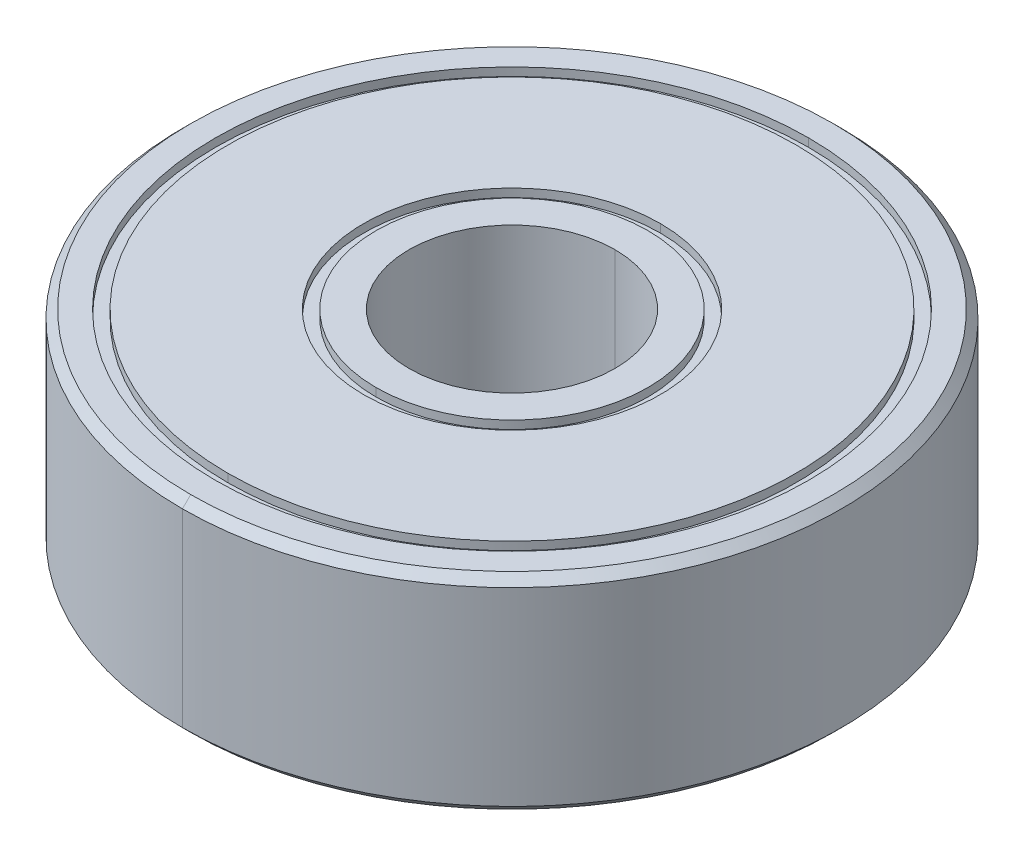
ISO-10303-21;
HEADER;
FILE_DESCRIPTION(('STEP AP214'),'2;1');
FILE_NAME('part.step','',(''),(''),'','','');
FILE_SCHEMA(('AUTOMOTIVE_DESIGN { 1 0 10303 214 1 1 1 1 }'));
ENDSEC;
DATA;
#1=APPLICATION_CONTEXT('core data for automotive mechanical design processes');
#2=APPLICATION_PROTOCOL_DEFINITION('international standard','automotive_design',2000,#1);
#3=PRODUCT_CONTEXT('',#1,'mechanical');
#4=PRODUCT('Part','Part','',(#3));
#5=PRODUCT_RELATED_PRODUCT_CATEGORY('part','',(#4));
#6=PRODUCT_DEFINITION_FORMATION('','',#4);
#7=PRODUCT_DEFINITION_CONTEXT('part definition',#1,'design');
#8=PRODUCT_DEFINITION('design','',#6,#7);
#9=PRODUCT_DEFINITION_SHAPE('','',#8);
#10=(LENGTH_UNIT() NAMED_UNIT(*) SI_UNIT(.MILLI.,.METRE.));
#11=(NAMED_UNIT(*) PLANE_ANGLE_UNIT() SI_UNIT($,.RADIAN.));
#12=(NAMED_UNIT(*) SI_UNIT($,.STERADIAN.) SOLID_ANGLE_UNIT());
#13=UNCERTAINTY_MEASURE_WITH_UNIT(LENGTH_MEASURE(1.E-05),#10,'distance_accuracy_value','');
#14=(GEOMETRIC_REPRESENTATION_CONTEXT(3) GLOBAL_UNCERTAINTY_ASSIGNED_CONTEXT((#13)) GLOBAL_UNIT_ASSIGNED_CONTEXT((#10,
#11,#12)) REPRESENTATION_CONTEXT('',''));
#15=CARTESIAN_POINT('',(0.,0.,0.));
#16=DIRECTION('',(0.,0.,1.));
#17=DIRECTION('',(1.,0.,0.));
#18=AXIS2_PLACEMENT_3D('',#15,#16,#17);
#19=CARTESIAN_POINT('',(0.,5.,0.));
#20=DIRECTION('',(0.,-1.,0.));
#21=DIRECTION('',(0.,0.,-1.));
#22=AXIS2_PLACEMENT_3D('',#19,#20,#21);
#23=CYLINDRICAL_SURFACE('',#22,2.5);
#24=DIRECTION('',(0.,-1.,0.));
#25=VECTOR('',#24,1.);
#26=CARTESIAN_POINT('',(0.,5.,2.5));
#27=LINE('',#26,#25);
#28=CARTESIAN_POINT('',(0.,5.,2.5));
#29=VERTEX_POINT('',#28);
#30=CARTESIAN_POINT('',(0.,0.,2.5));
#31=VERTEX_POINT('',#30);
#32=EDGE_CURVE('E168',#29,#31,#27,.T.);
#33=ORIENTED_EDGE('',*,*,#32,.T.);
#34=CARTESIAN_POINT('',(0.,0.,0.));
#35=DIRECTION('',(0.,-1.,0.));
#36=DIRECTION('',(0.,0.,-1.));
#37=AXIS2_PLACEMENT_3D('',#34,#35,#36);
#38=CIRCLE('',#37,2.5);
#39=CARTESIAN_POINT('',(0.,0.,-2.5));
#40=VERTEX_POINT('',#39);
#41=EDGE_CURVE('E178',#31,#40,#38,.T.);
#42=ORIENTED_EDGE('',*,*,#41,.T.);
#43=DIRECTION('',(0.,-1.,0.));
#44=VECTOR('',#43,1.);
#45=CARTESIAN_POINT('',(0.,5.,-2.5));
#46=LINE('',#45,#44);
#47=CARTESIAN_POINT('',(0.,5.,-2.5));
#48=VERTEX_POINT('',#47);
#49=EDGE_CURVE('E163',#40,#48,#46,.F.);
#50=ORIENTED_EDGE('',*,*,#49,.T.);
#51=CARTESIAN_POINT('',(0.,5.,0.));
#52=DIRECTION('',(0.,-1.,0.));
#53=DIRECTION('',(0.,0.,-1.));
#54=AXIS2_PLACEMENT_3D('',#51,#52,#53);
#55=CIRCLE('',#54,2.5);
#56=EDGE_CURVE('E176',#29,#48,#55,.T.);
#57=ORIENTED_EDGE('',*,*,#56,.F.);
#58=EDGE_LOOP('',(#33,#42,#50,#57));
#59=FACE_BOUND('',#58,.T.);
#60=ADVANCED_FACE('F17',(#59),#23,.F.);
#61=CARTESIAN_POINT('',(0.,5.,0.));
#62=DIRECTION('',(0.,-1.,0.));
#63=DIRECTION('',(0.,0.,-1.));
#64=AXIS2_PLACEMENT_3D('',#61,#62,#63);
#65=CYLINDRICAL_SURFACE('',#64,2.5);
#66=CARTESIAN_POINT('',(0.,5.,0.));
#67=DIRECTION('',(0.,-1.,0.));
#68=DIRECTION('',(0.,0.,-1.));
#69=AXIS2_PLACEMENT_3D('',#66,#67,#68);
#70=CIRCLE('',#69,2.5);
#71=EDGE_CURVE('E20',#48,#29,#70,.T.);
#72=ORIENTED_EDGE('',*,*,#71,.F.);
#73=ORIENTED_EDGE('',*,*,#49,.F.);
#74=CARTESIAN_POINT('',(0.,0.,0.));
#75=DIRECTION('',(0.,-1.,0.));
#76=DIRECTION('',(0.,0.,-1.));
#77=AXIS2_PLACEMENT_3D('',#74,#75,#76);
#78=CIRCLE('',#77,2.5);
#79=EDGE_CURVE('E173',#40,#31,#78,.T.);
#80=ORIENTED_EDGE('',*,*,#79,.T.);
#81=ORIENTED_EDGE('',*,*,#32,.F.);
#82=EDGE_LOOP('',(#72,#73,#80,#81));
#83=FACE_BOUND('',#82,.T.);
#84=ADVANCED_FACE('F169',(#83),#65,.F.);
#85=CARTESIAN_POINT('',(0.,5.,0.));
#86=DIRECTION('',(0.,1.,0.));
#87=DIRECTION('',(0.,0.,1.));
#88=AXIS2_PLACEMENT_3D('',#85,#86,#87);
#89=PLANE('',#88);
#90=ORIENTED_EDGE('',*,*,#71,.T.);
#91=ORIENTED_EDGE('',*,*,#56,.T.);
#92=EDGE_LOOP('',(#90,#91));
#93=FACE_BOUND('',#92,.T.);
#94=CARTESIAN_POINT('',(0.,5.,0.));
#95=DIRECTION('',(0.,1.,0.));
#96=DIRECTION('',(0.,0.,1.));
#97=AXIS2_PLACEMENT_3D('',#94,#95,#96);
#98=CIRCLE('',#97,3.3);
#99=CARTESIAN_POINT('',(0.,5.,3.3));
#100=VERTEX_POINT('',#99);
#101=CARTESIAN_POINT('',(0.,5.,-3.3));
#102=VERTEX_POINT('',#101);
#103=EDGE_CURVE('E185',#100,#102,#98,.F.);
#104=ORIENTED_EDGE('',*,*,#103,.F.);
#105=CARTESIAN_POINT('',(0.,5.,0.));
#106=DIRECTION('',(0.,1.,0.));
#107=DIRECTION('',(0.,0.,1.));
#108=AXIS2_PLACEMENT_3D('',#105,#106,#107);
#109=CIRCLE('',#108,3.3);
#110=EDGE_CURVE('E188',#102,#100,#109,.F.);
#111=ORIENTED_EDGE('',*,*,#110,.F.);
#112=EDGE_LOOP('',(#104,#111));
#113=FACE_BOUND('',#112,.T.);
#114=ADVANCED_FACE('F179',(#93,#113),#89,.T.);
#115=CARTESIAN_POINT('',(0.,0.,0.));
#116=DIRECTION('',(0.,1.,0.));
#117=DIRECTION('',(0.,0.,1.));
#118=AXIS2_PLACEMENT_3D('',#115,#116,#117);
#119=PLANE('',#118);
#120=ORIENTED_EDGE('',*,*,#41,.F.);
#121=ORIENTED_EDGE('',*,*,#79,.F.);
#122=EDGE_LOOP('',(#120,#121));
#123=FACE_BOUND('',#122,.T.);
#124=CARTESIAN_POINT('',(0.,0.,0.));
#125=DIRECTION('',(0.,1.,0.));
#126=DIRECTION('',(0.,0.,1.));
#127=AXIS2_PLACEMENT_3D('',#124,#125,#126);
#128=CIRCLE('',#127,3.3);
#129=CARTESIAN_POINT('',(0.,0.,-3.3));
#130=VERTEX_POINT('',#129);
#131=CARTESIAN_POINT('',(0.,0.,3.3));
#132=VERTEX_POINT('',#131);
#133=EDGE_CURVE('E217',#130,#132,#128,.T.);
#134=ORIENTED_EDGE('',*,*,#133,.F.);
#135=CARTESIAN_POINT('',(0.,0.,0.));
#136=DIRECTION('',(0.,1.,0.));
#137=DIRECTION('',(0.,0.,1.));
#138=AXIS2_PLACEMENT_3D('',#135,#136,#137);
#139=CIRCLE('',#138,3.3);
#140=EDGE_CURVE('E201',#132,#130,#139,.T.);
#141=ORIENTED_EDGE('',*,*,#140,.F.);
#142=EDGE_LOOP('',(#134,#141));
#143=FACE_BOUND('',#142,.T.);
#144=ADVANCED_FACE('F182',(#123,#143),#119,.F.);
#145=CARTESIAN_POINT('',(0.,5.,0.));
#146=DIRECTION('',(0.,1.,0.));
#147=DIRECTION('',(0.,0.,1.));
#148=AXIS2_PLACEMENT_3D('',#145,#146,#147);
#149=CYLINDRICAL_SURFACE('',#148,3.3);
#150=DIRECTION('',(0.,1.,0.));
#151=VECTOR('',#150,1.);
#152=CARTESIAN_POINT('',(0.,5.,3.3));
#153=LINE('',#152,#151);
#154=CARTESIAN_POINT('',(0.,4.8,3.3));
#155=VERTEX_POINT('',#154);
#156=EDGE_CURVE('E194',#100,#155,#153,.F.);
#157=ORIENTED_EDGE('',*,*,#156,.F.);
#158=ORIENTED_EDGE('',*,*,#103,.T.);
#159=DIRECTION('',(0.,1.,0.));
#160=VECTOR('',#159,1.);
#161=CARTESIAN_POINT('',(0.,5.,-3.3));
#162=LINE('',#161,#160);
#163=CARTESIAN_POINT('',(0.,4.8,-3.3));
#164=VERTEX_POINT('',#163);
#165=EDGE_CURVE('E191',#164,#102,#162,.T.);
#166=ORIENTED_EDGE('',*,*,#165,.F.);
#167=CARTESIAN_POINT('',(0.,4.8,0.));
#168=DIRECTION('',(0.,1.,0.));
#169=DIRECTION('',(0.,0.,1.));
#170=AXIS2_PLACEMENT_3D('',#167,#168,#169);
#171=CIRCLE('',#170,3.3);
#172=EDGE_CURVE('E197',#155,#164,#171,.F.);
#173=ORIENTED_EDGE('',*,*,#172,.F.);
#174=EDGE_LOOP('',(#157,#158,#166,#173));
#175=FACE_BOUND('',#174,.T.);
#176=ADVANCED_FACE('F195',(#175),#149,.T.);
#177=CARTESIAN_POINT('',(0.,5.,0.));
#178=DIRECTION('',(0.,1.,0.));
#179=DIRECTION('',(0.,0.,1.));
#180=AXIS2_PLACEMENT_3D('',#177,#178,#179);
#181=CYLINDRICAL_SURFACE('',#180,3.3);
#182=ORIENTED_EDGE('',*,*,#110,.T.);
#183=ORIENTED_EDGE('',*,*,#156,.T.);
#184=CARTESIAN_POINT('',(0.,4.8,0.));
#185=DIRECTION('',(0.,1.,0.));
#186=DIRECTION('',(0.,0.,1.));
#187=AXIS2_PLACEMENT_3D('',#184,#185,#186);
#188=CIRCLE('',#187,3.3);
#189=EDGE_CURVE('E324',#164,#155,#188,.F.);
#190=ORIENTED_EDGE('',*,*,#189,.F.);
#191=ORIENTED_EDGE('',*,*,#165,.T.);
#192=EDGE_LOOP('',(#182,#183,#190,#191));
#193=FACE_BOUND('',#192,.T.);
#194=ADVANCED_FACE('F203',(#193),#181,.T.);
#195=CARTESIAN_POINT('',(0.,5.,0.));
#196=DIRECTION('',(0.,1.,0.));
#197=DIRECTION('',(0.,0.,1.));
#198=AXIS2_PLACEMENT_3D('',#195,#196,#197);
#199=CYLINDRICAL_SURFACE('',#198,3.3);
#200=CARTESIAN_POINT('',(0.,0.2,0.));
#201=DIRECTION('',(0.,1.,0.));
#202=DIRECTION('',(0.,0.,1.));
#203=AXIS2_PLACEMENT_3D('',#200,#201,#202);
#204=CIRCLE('',#203,3.3);
#205=CARTESIAN_POINT('',(0.,0.2,3.3));
#206=VERTEX_POINT('',#205);
#207=CARTESIAN_POINT('',(0.,0.2,-3.3));
#208=VERTEX_POINT('',#207);
#209=EDGE_CURVE('E322',#206,#208,#204,.T.);
#210=ORIENTED_EDGE('',*,*,#209,.F.);
#211=DIRECTION('',(0.,1.,0.));
#212=VECTOR('',#211,1.);
#213=CARTESIAN_POINT('',(0.,5.,3.3));
#214=LINE('',#213,#212);
#215=EDGE_CURVE('E222',#132,#206,#214,.T.);
#216=ORIENTED_EDGE('',*,*,#215,.F.);
#217=ORIENTED_EDGE('',*,*,#140,.T.);
#218=DIRECTION('',(0.,1.,0.));
#219=VECTOR('',#218,1.);
#220=CARTESIAN_POINT('',(0.,5.,-3.3));
#221=LINE('',#220,#219);
#222=EDGE_CURVE('E223',#208,#130,#221,.F.);
#223=ORIENTED_EDGE('',*,*,#222,.F.);
#224=EDGE_LOOP('',(#210,#216,#217,#223));
#225=FACE_BOUND('',#224,.T.);
#226=ADVANCED_FACE('F330',(#225),#199,.T.);
#227=CARTESIAN_POINT('',(0.,5.,0.));
#228=DIRECTION('',(0.,1.,0.));
#229=DIRECTION('',(0.,0.,1.));
#230=AXIS2_PLACEMENT_3D('',#227,#228,#229);
#231=CYLINDRICAL_SURFACE('',#230,3.3);
#232=ORIENTED_EDGE('',*,*,#215,.T.);
#233=CARTESIAN_POINT('',(0.,0.2,0.));
#234=DIRECTION('',(0.,1.,0.));
#235=DIRECTION('',(0.,0.,1.));
#236=AXIS2_PLACEMENT_3D('',#233,#234,#235);
#237=CIRCLE('',#236,3.3);
#238=EDGE_CURVE('E227',#208,#206,#237,.T.);
#239=ORIENTED_EDGE('',*,*,#238,.F.);
#240=ORIENTED_EDGE('',*,*,#222,.T.);
#241=ORIENTED_EDGE('',*,*,#133,.T.);
#242=EDGE_LOOP('',(#232,#239,#240,#241));
#243=FACE_BOUND('',#242,.T.);
#244=ADVANCED_FACE('F225',(#243),#231,.T.);
#245=CARTESIAN_POINT('',(0.,4.8,-3.3));
#246=DIRECTION('',(0.,1.,0.));
#247=DIRECTION('',(0.,0.,1.));
#248=AXIS2_PLACEMENT_3D('',#245,#246,#247);
#249=PLANE('',#248);
#250=CARTESIAN_POINT('',(0.,4.8,0.));
#251=DIRECTION('',(0.,1.,0.));
#252=DIRECTION('',(0.,0.,1.));
#253=AXIS2_PLACEMENT_3D('',#250,#251,#252);
#254=CIRCLE('',#253,3.6);
#255=CARTESIAN_POINT('',(0.,4.8,3.6));
#256=VERTEX_POINT('',#255);
#257=CARTESIAN_POINT('',(0.,4.8,-3.6));
#258=VERTEX_POINT('',#257);
#259=EDGE_CURVE('E316',#256,#258,#254,.T.);
#260=ORIENTED_EDGE('',*,*,#259,.T.);
#261=CARTESIAN_POINT('',(0.,4.8,0.));
#262=DIRECTION('',(0.,1.,0.));
#263=DIRECTION('',(0.,0.,1.));
#264=AXIS2_PLACEMENT_3D('',#261,#262,#263);
#265=CIRCLE('',#264,3.6);
#266=EDGE_CURVE('E319',#258,#256,#265,.T.);
#267=ORIENTED_EDGE('',*,*,#266,.T.);
#268=EDGE_LOOP('',(#260,#267));
#269=FACE_BOUND('',#268,.T.);
#270=ORIENTED_EDGE('',*,*,#172,.T.);
#271=ORIENTED_EDGE('',*,*,#189,.T.);
#272=EDGE_LOOP('',(#270,#271));
#273=FACE_BOUND('',#272,.T.);
#274=ADVANCED_FACE('F338',(#269,#273),#249,.T.);
#275=CARTESIAN_POINT('',(0.,0.2,-3.3));
#276=DIRECTION('',(0.,-1.,0.));
#277=DIRECTION('',(0.,0.,-1.));
#278=AXIS2_PLACEMENT_3D('',#275,#276,#277);
#279=PLANE('',#278);
#280=ORIENTED_EDGE('',*,*,#209,.T.);
#281=ORIENTED_EDGE('',*,*,#238,.T.);
#282=EDGE_LOOP('',(#280,#281));
#283=FACE_BOUND('',#282,.T.);
#284=CARTESIAN_POINT('',(0.,0.2,0.));
#285=DIRECTION('',(0.,1.,0.));
#286=DIRECTION('',(0.,0.,1.));
#287=AXIS2_PLACEMENT_3D('',#284,#285,#286);
#288=CIRCLE('',#287,3.6);
#289=CARTESIAN_POINT('',(0.,0.2,3.6));
#290=VERTEX_POINT('',#289);
#291=CARTESIAN_POINT('',(0.,0.2,-3.6));
#292=VERTEX_POINT('',#291);
#293=EDGE_CURVE('E310',#290,#292,#288,.F.);
#294=ORIENTED_EDGE('',*,*,#293,.T.);
#295=CARTESIAN_POINT('',(0.,0.2,0.));
#296=DIRECTION('',(0.,1.,0.));
#297=DIRECTION('',(0.,0.,1.));
#298=AXIS2_PLACEMENT_3D('',#295,#296,#297);
#299=CIRCLE('',#298,3.6);
#300=EDGE_CURVE('E313',#292,#290,#299,.F.);
#301=ORIENTED_EDGE('',*,*,#300,.T.);
#302=EDGE_LOOP('',(#294,#301));
#303=FACE_BOUND('',#302,.T.);
#304=ADVANCED_FACE('F328',(#283,#303),#279,.T.);
#305=CARTESIAN_POINT('',(0.,5.,0.));
#306=DIRECTION('',(0.,1.,0.));
#307=DIRECTION('',(0.,0.,1.));
#308=AXIS2_PLACEMENT_3D('',#305,#306,#307);
#309=CYLINDRICAL_SURFACE('',#308,3.6);
#310=DIRECTION('',(0.,1.,0.));
#311=VECTOR('',#310,1.);
#312=CARTESIAN_POINT('',(0.,5.,-3.6));
#313=LINE('',#312,#311);
#314=CARTESIAN_POINT('',(0.,5.,-3.6));
#315=VERTEX_POINT('',#314);
#316=EDGE_CURVE('E315',#258,#315,#313,.T.);
#317=ORIENTED_EDGE('',*,*,#316,.T.);
#318=CARTESIAN_POINT('',(0.,5.,0.));
#319=DIRECTION('',(0.,1.,0.));
#320=DIRECTION('',(0.,0.,1.));
#321=AXIS2_PLACEMENT_3D('',#318,#319,#320);
#322=CIRCLE('',#321,3.6);
#323=CARTESIAN_POINT('',(0.,5.,3.6));
#324=VERTEX_POINT('',#323);
#325=EDGE_CURVE('E306',#324,#315,#322,.F.);
#326=ORIENTED_EDGE('',*,*,#325,.F.);
#327=DIRECTION('',(0.,1.,0.));
#328=VECTOR('',#327,1.);
#329=CARTESIAN_POINT('',(0.,5.,3.6));
#330=LINE('',#329,#328);
#331=EDGE_CURVE('E318',#324,#256,#330,.F.);
#332=ORIENTED_EDGE('',*,*,#331,.T.);
#333=ORIENTED_EDGE('',*,*,#266,.F.);
#334=EDGE_LOOP('',(#317,#326,#332,#333));
#335=FACE_BOUND('',#334,.T.);
#336=ADVANCED_FACE('F435',(#335),#309,.F.);
#337=CARTESIAN_POINT('',(0.,5.,0.));
#338=DIRECTION('',(0.,1.,0.));
#339=DIRECTION('',(0.,0.,1.));
#340=AXIS2_PLACEMENT_3D('',#337,#338,#339);
#341=CYLINDRICAL_SURFACE('',#340,3.6);
#342=ORIENTED_EDGE('',*,*,#259,.F.);
#343=ORIENTED_EDGE('',*,*,#331,.F.);
#344=CARTESIAN_POINT('',(0.,5.,0.));
#345=DIRECTION('',(0.,1.,0.));
#346=DIRECTION('',(0.,0.,1.));
#347=AXIS2_PLACEMENT_3D('',#344,#345,#346);
#348=CIRCLE('',#347,3.6);
#349=EDGE_CURVE('E303',#315,#324,#348,.F.);
#350=ORIENTED_EDGE('',*,*,#349,.F.);
#351=ORIENTED_EDGE('',*,*,#316,.F.);
#352=EDGE_LOOP('',(#342,#343,#350,#351));
#353=FACE_BOUND('',#352,.T.);
#354=ADVANCED_FACE('F431',(#353),#341,.F.);
#355=CARTESIAN_POINT('',(0.,5.,0.));
#356=DIRECTION('',(0.,1.,0.));
#357=DIRECTION('',(0.,0.,1.));
#358=AXIS2_PLACEMENT_3D('',#355,#356,#357);
#359=CYLINDRICAL_SURFACE('',#358,3.6);
#360=CARTESIAN_POINT('',(0.,0.,0.));
#361=DIRECTION('',(0.,1.,0.));
#362=DIRECTION('',(0.,0.,1.));
#363=AXIS2_PLACEMENT_3D('',#360,#361,#362);
#364=CIRCLE('',#363,3.6);
#365=CARTESIAN_POINT('',(0.,0.,-3.6));
#366=VERTEX_POINT('',#365);
#367=CARTESIAN_POINT('',(0.,0.,3.6));
#368=VERTEX_POINT('',#367);
#369=EDGE_CURVE('E301',#366,#368,#364,.F.);
#370=ORIENTED_EDGE('',*,*,#369,.T.);
#371=DIRECTION('',(0.,1.,0.));
#372=VECTOR('',#371,1.);
#373=CARTESIAN_POINT('',(0.,5.,3.6));
#374=LINE('',#373,#372);
#375=EDGE_CURVE('E312',#368,#290,#374,.T.);
#376=ORIENTED_EDGE('',*,*,#375,.T.);
#377=ORIENTED_EDGE('',*,*,#300,.F.);
#378=DIRECTION('',(0.,1.,0.));
#379=VECTOR('',#378,1.);
#380=CARTESIAN_POINT('',(0.,5.,-3.6));
#381=LINE('',#380,#379);
#382=EDGE_CURVE('E309',#292,#366,#381,.F.);
#383=ORIENTED_EDGE('',*,*,#382,.T.);
#384=EDGE_LOOP('',(#370,#376,#377,#383));
#385=FACE_BOUND('',#384,.T.);
#386=ADVANCED_FACE('F427',(#385),#359,.F.);
#387=CARTESIAN_POINT('',(0.,5.,0.));
#388=DIRECTION('',(0.,1.,0.));
#389=DIRECTION('',(0.,0.,1.));
#390=AXIS2_PLACEMENT_3D('',#387,#388,#389);
#391=CYLINDRICAL_SURFACE('',#390,3.6);
#392=ORIENTED_EDGE('',*,*,#382,.F.);
#393=ORIENTED_EDGE('',*,*,#293,.F.);
#394=ORIENTED_EDGE('',*,*,#375,.F.);
#395=CARTESIAN_POINT('',(0.,0.,0.));
#396=DIRECTION('',(0.,1.,0.));
#397=DIRECTION('',(0.,0.,1.));
#398=AXIS2_PLACEMENT_3D('',#395,#396,#397);
#399=CIRCLE('',#398,3.6);
#400=EDGE_CURVE('E298',#368,#366,#399,.F.);
#401=ORIENTED_EDGE('',*,*,#400,.T.);
#402=EDGE_LOOP('',(#392,#393,#394,#401));
#403=FACE_BOUND('',#402,.T.);
#404=ADVANCED_FACE('F423',(#403),#391,.F.);
#405=CARTESIAN_POINT('',(0.,5.,0.));
#406=DIRECTION('',(0.,1.,0.));
#407=DIRECTION('',(0.,0.,1.));
#408=AXIS2_PLACEMENT_3D('',#405,#406,#407);
#409=PLANE('',#408);
#410=CARTESIAN_POINT('',(0.,5.,0.));
#411=DIRECTION('',(0.,1.,0.));
#412=DIRECTION('',(0.,0.,1.));
#413=AXIS2_PLACEMENT_3D('',#410,#411,#412);
#414=CIRCLE('',#413,6.9);
#415=CARTESIAN_POINT('',(0.,5.,6.9));
#416=VERTEX_POINT('',#415);
#417=CARTESIAN_POINT('',(0.,5.,-6.9));
#418=VERTEX_POINT('',#417);
#419=EDGE_CURVE('E296',#416,#418,#414,.F.);
#420=ORIENTED_EDGE('',*,*,#419,.F.);
#421=CARTESIAN_POINT('',(0.,5.,0.));
#422=DIRECTION('',(0.,1.,0.));
#423=DIRECTION('',(0.,0.,1.));
#424=AXIS2_PLACEMENT_3D('',#421,#422,#423);
#425=CIRCLE('',#424,6.9);
#426=EDGE_CURVE('E292',#418,#416,#425,.F.);
#427=ORIENTED_EDGE('',*,*,#426,.F.);
#428=EDGE_LOOP('',(#420,#427));
#429=FACE_BOUND('',#428,.T.);
#430=ORIENTED_EDGE('',*,*,#325,.T.);
#431=ORIENTED_EDGE('',*,*,#349,.T.);
#432=EDGE_LOOP('',(#430,#431));
#433=FACE_BOUND('',#432,.T.);
#434=ADVANCED_FACE('F419',(#429,#433),#409,.T.);
#435=CARTESIAN_POINT('',(0.,0.,0.));
#436=DIRECTION('',(0.,1.,0.));
#437=DIRECTION('',(0.,0.,1.));
#438=AXIS2_PLACEMENT_3D('',#435,#436,#437);
#439=PLANE('',#438);
#440=ORIENTED_EDGE('',*,*,#369,.F.);
#441=ORIENTED_EDGE('',*,*,#400,.F.);
#442=EDGE_LOOP('',(#440,#441));
#443=FACE_BOUND('',#442,.T.);
#444=CARTESIAN_POINT('',(0.,0.,0.));
#445=DIRECTION('',(0.,1.,0.));
#446=DIRECTION('',(0.,0.,1.));
#447=AXIS2_PLACEMENT_3D('',#444,#445,#446);
#448=CIRCLE('',#447,6.9);
#449=CARTESIAN_POINT('',(0.,0.,-6.9));
#450=VERTEX_POINT('',#449);
#451=CARTESIAN_POINT('',(0.,0.,6.9));
#452=VERTEX_POINT('',#451);
#453=EDGE_CURVE('E285',#450,#452,#448,.T.);
#454=ORIENTED_EDGE('',*,*,#453,.F.);
#455=CARTESIAN_POINT('',(0.,0.,0.));
#456=DIRECTION('',(0.,1.,0.));
#457=DIRECTION('',(0.,0.,1.));
#458=AXIS2_PLACEMENT_3D('',#455,#456,#457);
#459=CIRCLE('',#458,6.9);
#460=EDGE_CURVE('E289',#452,#450,#459,.T.);
#461=ORIENTED_EDGE('',*,*,#460,.F.);
#462=EDGE_LOOP('',(#454,#461));
#463=FACE_BOUND('',#462,.T.);
#464=ADVANCED_FACE('F415',(#443,#463),#439,.F.);
#465=CARTESIAN_POINT('',(0.,5.,0.));
#466=DIRECTION('',(0.,1.,0.));
#467=DIRECTION('',(0.,0.,1.));
#468=AXIS2_PLACEMENT_3D('',#465,#466,#467);
#469=CYLINDRICAL_SURFACE('',#468,6.9);
#470=DIRECTION('',(0.,1.,0.));
#471=VECTOR('',#470,1.);
#472=CARTESIAN_POINT('',(0.,5.,6.9));
#473=LINE('',#472,#471);
#474=CARTESIAN_POINT('',(0.,4.8,6.9));
#475=VERTEX_POINT('',#474);
#476=EDGE_CURVE('E291',#416,#475,#473,.F.);
#477=ORIENTED_EDGE('',*,*,#476,.F.);
#478=ORIENTED_EDGE('',*,*,#419,.T.);
#479=DIRECTION('',(0.,1.,0.));
#480=VECTOR('',#479,1.);
#481=CARTESIAN_POINT('',(0.,5.,-6.9));
#482=LINE('',#481,#480);
#483=CARTESIAN_POINT('',(0.,4.8,-6.9));
#484=VERTEX_POINT('',#483);
#485=EDGE_CURVE('E295',#484,#418,#482,.T.);
#486=ORIENTED_EDGE('',*,*,#485,.F.);
#487=CARTESIAN_POINT('',(0.,4.8,0.));
#488=DIRECTION('',(0.,1.,0.));
#489=DIRECTION('',(0.,0.,1.));
#490=AXIS2_PLACEMENT_3D('',#487,#488,#489);
#491=CIRCLE('',#490,6.9);
#492=EDGE_CURVE('E281',#475,#484,#491,.F.);
#493=ORIENTED_EDGE('',*,*,#492,.F.);
#494=EDGE_LOOP('',(#477,#478,#486,#493));
#495=FACE_BOUND('',#494,.T.);
#496=ADVANCED_FACE('F411',(#495),#469,.T.);
#497=CARTESIAN_POINT('',(0.,5.,0.));
#498=DIRECTION('',(0.,1.,0.));
#499=DIRECTION('',(0.,0.,1.));
#500=AXIS2_PLACEMENT_3D('',#497,#498,#499);
#501=CYLINDRICAL_SURFACE('',#500,6.9);
#502=ORIENTED_EDGE('',*,*,#426,.T.);
#503=ORIENTED_EDGE('',*,*,#476,.T.);
#504=CARTESIAN_POINT('',(0.,4.8,0.));
#505=DIRECTION('',(0.,1.,0.));
#506=DIRECTION('',(0.,0.,1.));
#507=AXIS2_PLACEMENT_3D('',#504,#505,#506);
#508=CIRCLE('',#507,6.9);
#509=EDGE_CURVE('E278',#484,#475,#508,.F.);
#510=ORIENTED_EDGE('',*,*,#509,.F.);
#511=ORIENTED_EDGE('',*,*,#485,.T.);
#512=EDGE_LOOP('',(#502,#503,#510,#511));
#513=FACE_BOUND('',#512,.T.);
#514=ADVANCED_FACE('F407',(#513),#501,.T.);
#515=CARTESIAN_POINT('',(0.,5.,0.));
#516=DIRECTION('',(0.,1.,0.));
#517=DIRECTION('',(0.,0.,1.));
#518=AXIS2_PLACEMENT_3D('',#515,#516,#517);
#519=CYLINDRICAL_SURFACE('',#518,6.9);
#520=CARTESIAN_POINT('',(0.,0.2,0.));
#521=DIRECTION('',(0.,1.,0.));
#522=DIRECTION('',(0.,0.,1.));
#523=AXIS2_PLACEMENT_3D('',#520,#521,#522);
#524=CIRCLE('',#523,6.9);
#525=CARTESIAN_POINT('',(0.,0.2,6.9));
#526=VERTEX_POINT('',#525);
#527=CARTESIAN_POINT('',(0.,0.2,-6.9));
#528=VERTEX_POINT('',#527);
#529=EDGE_CURVE('E275',#526,#528,#524,.T.);
#530=ORIENTED_EDGE('',*,*,#529,.F.);
#531=DIRECTION('',(0.,1.,0.));
#532=VECTOR('',#531,1.);
#533=CARTESIAN_POINT('',(0.,5.,6.9));
#534=LINE('',#533,#532);
#535=EDGE_CURVE('E284',#452,#526,#534,.T.);
#536=ORIENTED_EDGE('',*,*,#535,.F.);
#537=ORIENTED_EDGE('',*,*,#460,.T.);
#538=DIRECTION('',(0.,1.,0.));
#539=VECTOR('',#538,1.);
#540=CARTESIAN_POINT('',(0.,5.,-6.9));
#541=LINE('',#540,#539);
#542=EDGE_CURVE('E288',#528,#450,#541,.F.);
#543=ORIENTED_EDGE('',*,*,#542,.F.);
#544=EDGE_LOOP('',(#530,#536,#537,#543));
#545=FACE_BOUND('',#544,.T.);
#546=ADVANCED_FACE('F403',(#545),#519,.T.);
#547=CARTESIAN_POINT('',(0.,5.,0.));
#548=DIRECTION('',(0.,1.,0.));
#549=DIRECTION('',(0.,0.,1.));
#550=AXIS2_PLACEMENT_3D('',#547,#548,#549);
#551=CYLINDRICAL_SURFACE('',#550,6.9);
#552=ORIENTED_EDGE('',*,*,#535,.T.);
#553=CARTESIAN_POINT('',(0.,0.2,0.));
#554=DIRECTION('',(0.,1.,0.));
#555=DIRECTION('',(0.,0.,1.));
#556=AXIS2_PLACEMENT_3D('',#553,#554,#555);
#557=CIRCLE('',#556,6.9);
#558=EDGE_CURVE('E272',#528,#526,#557,.T.);
#559=ORIENTED_EDGE('',*,*,#558,.F.);
#560=ORIENTED_EDGE('',*,*,#542,.T.);
#561=ORIENTED_EDGE('',*,*,#453,.T.);
#562=EDGE_LOOP('',(#552,#559,#560,#561));
#563=FACE_BOUND('',#562,.T.);
#564=ADVANCED_FACE('F399',(#563),#551,.T.);
#565=CARTESIAN_POINT('',(0.,4.8,-7.2));
#566=DIRECTION('',(0.,1.,0.));
#567=DIRECTION('',(0.,0.,1.));
#568=AXIS2_PLACEMENT_3D('',#565,#566,#567);
#569=PLANE('',#568);
#570=CARTESIAN_POINT('',(0.,4.8,0.));
#571=DIRECTION('',(0.,1.,0.));
#572=DIRECTION('',(0.,0.,1.));
#573=AXIS2_PLACEMENT_3D('',#570,#571,#572);
#574=CIRCLE('',#573,7.2);
#575=CARTESIAN_POINT('',(0.,4.8,7.2));
#576=VERTEX_POINT('',#575);
#577=CARTESIAN_POINT('',(0.,4.8,-7.2));
#578=VERTEX_POINT('',#577);
#579=EDGE_CURVE('E267',#576,#578,#574,.T.);
#580=ORIENTED_EDGE('',*,*,#579,.T.);
#581=CARTESIAN_POINT('',(0.,4.8,0.));
#582=DIRECTION('',(0.,1.,0.));
#583=DIRECTION('',(0.,0.,1.));
#584=AXIS2_PLACEMENT_3D('',#581,#582,#583);
#585=CIRCLE('',#584,7.2);
#586=EDGE_CURVE('E270',#578,#576,#585,.T.);
#587=ORIENTED_EDGE('',*,*,#586,.T.);
#588=EDGE_LOOP('',(#580,#587));
#589=FACE_BOUND('',#588,.T.);
#590=ORIENTED_EDGE('',*,*,#492,.T.);
#591=ORIENTED_EDGE('',*,*,#509,.T.);
#592=EDGE_LOOP('',(#590,#591));
#593=FACE_BOUND('',#592,.T.);
#594=ADVANCED_FACE('F395',(#589,#593),#569,.T.);
#595=CARTESIAN_POINT('',(0.,0.2,-7.2));
#596=DIRECTION('',(0.,-1.,0.));
#597=DIRECTION('',(0.,0.,-1.));
#598=AXIS2_PLACEMENT_3D('',#595,#596,#597);
#599=PLANE('',#598);
#600=ORIENTED_EDGE('',*,*,#529,.T.);
#601=ORIENTED_EDGE('',*,*,#558,.T.);
#602=EDGE_LOOP('',(#600,#601));
#603=FACE_BOUND('',#602,.T.);
#604=CARTESIAN_POINT('',(0.,0.2,0.));
#605=DIRECTION('',(0.,1.,0.));
#606=DIRECTION('',(0.,0.,1.));
#607=AXIS2_PLACEMENT_3D('',#604,#605,#606);
#608=CIRCLE('',#607,7.2);
#609=CARTESIAN_POINT('',(0.,0.2,7.2));
#610=VERTEX_POINT('',#609);
#611=CARTESIAN_POINT('',(0.,0.2,-7.2));
#612=VERTEX_POINT('',#611);
#613=EDGE_CURVE('E261',#610,#612,#608,.F.);
#614=ORIENTED_EDGE('',*,*,#613,.T.);
#615=CARTESIAN_POINT('',(0.,0.2,0.));
#616=DIRECTION('',(0.,1.,0.));
#617=DIRECTION('',(0.,0.,1.));
#618=AXIS2_PLACEMENT_3D('',#615,#616,#617);
#619=CIRCLE('',#618,7.2);
#620=EDGE_CURVE('E264',#612,#610,#619,.F.);
#621=ORIENTED_EDGE('',*,*,#620,.T.);
#622=EDGE_LOOP('',(#614,#621));
#623=FACE_BOUND('',#622,.T.);
#624=ADVANCED_FACE('F391',(#603,#623),#599,.T.);
#625=CARTESIAN_POINT('',(0.,5.,0.));
#626=DIRECTION('',(0.,1.,0.));
#627=DIRECTION('',(0.,0.,1.));
#628=AXIS2_PLACEMENT_3D('',#625,#626,#627);
#629=CYLINDRICAL_SURFACE('',#628,7.2);
#630=DIRECTION('',(0.,1.,0.));
#631=VECTOR('',#630,1.);
#632=CARTESIAN_POINT('',(0.,5.,-7.2));
#633=LINE('',#632,#631);
#634=CARTESIAN_POINT('',(0.,5.,-7.2));
#635=VERTEX_POINT('',#634);
#636=EDGE_CURVE('E266',#578,#635,#633,.T.);
#637=ORIENTED_EDGE('',*,*,#636,.T.);
#638=CARTESIAN_POINT('',(0.,5.,0.));
#639=DIRECTION('',(0.,1.,0.));
#640=DIRECTION('',(0.,0.,1.));
#641=AXIS2_PLACEMENT_3D('',#638,#639,#640);
#642=CIRCLE('',#641,7.2);
#643=CARTESIAN_POINT('',(0.,5.,7.2));
#644=VERTEX_POINT('',#643);
#645=EDGE_CURVE('E257',#644,#635,#642,.F.);
#646=ORIENTED_EDGE('',*,*,#645,.F.);
#647=DIRECTION('',(0.,1.,0.));
#648=VECTOR('',#647,1.);
#649=CARTESIAN_POINT('',(0.,5.,7.2));
#650=LINE('',#649,#648);
#651=EDGE_CURVE('E269',#644,#576,#650,.F.);
#652=ORIENTED_EDGE('',*,*,#651,.T.);
#653=ORIENTED_EDGE('',*,*,#586,.F.);
#654=EDGE_LOOP('',(#637,#646,#652,#653));
#655=FACE_BOUND('',#654,.T.);
#656=ADVANCED_FACE('F387',(#655),#629,.F.);
#657=CARTESIAN_POINT('',(0.,5.,0.));
#658=DIRECTION('',(0.,1.,0.));
#659=DIRECTION('',(0.,0.,1.));
#660=AXIS2_PLACEMENT_3D('',#657,#658,#659);
#661=CYLINDRICAL_SURFACE('',#660,7.2);
#662=ORIENTED_EDGE('',*,*,#579,.F.);
#663=ORIENTED_EDGE('',*,*,#651,.F.);
#664=CARTESIAN_POINT('',(0.,5.,0.));
#665=DIRECTION('',(0.,1.,0.));
#666=DIRECTION('',(0.,0.,1.));
#667=AXIS2_PLACEMENT_3D('',#664,#665,#666);
#668=CIRCLE('',#667,7.2);
#669=EDGE_CURVE('E254',#635,#644,#668,.F.);
#670=ORIENTED_EDGE('',*,*,#669,.F.);
#671=ORIENTED_EDGE('',*,*,#636,.F.);
#672=EDGE_LOOP('',(#662,#663,#670,#671));
#673=FACE_BOUND('',#672,.T.);
#674=ADVANCED_FACE('F383',(#673),#661,.F.);
#675=CARTESIAN_POINT('',(0.,5.,0.));
#676=DIRECTION('',(0.,1.,0.));
#677=DIRECTION('',(0.,0.,1.));
#678=AXIS2_PLACEMENT_3D('',#675,#676,#677);
#679=CYLINDRICAL_SURFACE('',#678,7.2);
#680=CARTESIAN_POINT('',(0.,0.,0.));
#681=DIRECTION('',(0.,1.,0.));
#682=DIRECTION('',(0.,0.,1.));
#683=AXIS2_PLACEMENT_3D('',#680,#681,#682);
#684=CIRCLE('',#683,7.2);
#685=CARTESIAN_POINT('',(0.,0.,-7.2));
#686=VERTEX_POINT('',#685);
#687=CARTESIAN_POINT('',(0.,0.,7.2));
#688=VERTEX_POINT('',#687);
#689=EDGE_CURVE('E252',#686,#688,#684,.F.);
#690=ORIENTED_EDGE('',*,*,#689,.T.);
#691=DIRECTION('',(0.,1.,0.));
#692=VECTOR('',#691,1.);
#693=CARTESIAN_POINT('',(0.,5.,7.2));
#694=LINE('',#693,#692);
#695=EDGE_CURVE('E263',#688,#610,#694,.T.);
#696=ORIENTED_EDGE('',*,*,#695,.T.);
#697=ORIENTED_EDGE('',*,*,#620,.F.);
#698=DIRECTION('',(0.,1.,0.));
#699=VECTOR('',#698,1.);
#700=CARTESIAN_POINT('',(0.,5.,-7.2));
#701=LINE('',#700,#699);
#702=EDGE_CURVE('E260',#612,#686,#701,.F.);
#703=ORIENTED_EDGE('',*,*,#702,.T.);
#704=EDGE_LOOP('',(#690,#696,#697,#703));
#705=FACE_BOUND('',#704,.T.);
#706=ADVANCED_FACE('F379',(#705),#679,.F.);
#707=CARTESIAN_POINT('',(0.,5.,0.));
#708=DIRECTION('',(0.,1.,0.));
#709=DIRECTION('',(0.,0.,1.));
#710=AXIS2_PLACEMENT_3D('',#707,#708,#709);
#711=CYLINDRICAL_SURFACE('',#710,7.2);
#712=ORIENTED_EDGE('',*,*,#702,.F.);
#713=ORIENTED_EDGE('',*,*,#613,.F.);
#714=ORIENTED_EDGE('',*,*,#695,.F.);
#715=CARTESIAN_POINT('',(0.,0.,0.));
#716=DIRECTION('',(0.,1.,0.));
#717=DIRECTION('',(0.,0.,1.));
#718=AXIS2_PLACEMENT_3D('',#715,#716,#717);
#719=CIRCLE('',#718,7.2);
#720=EDGE_CURVE('E249',#688,#686,#719,.F.);
#721=ORIENTED_EDGE('',*,*,#720,.T.);
#722=EDGE_LOOP('',(#712,#713,#714,#721));
#723=FACE_BOUND('',#722,.T.);
#724=ADVANCED_FACE('F375',(#723),#711,.F.);
#725=CARTESIAN_POINT('',(0.,5.,0.));
#726=DIRECTION('',(0.,1.,0.));
#727=DIRECTION('',(0.,0.,1.));
#728=AXIS2_PLACEMENT_3D('',#725,#726,#727);
#729=PLANE('',#728);
#730=CARTESIAN_POINT('',(0.,5.,0.));
#731=DIRECTION('',(0.,-1.,0.));
#732=DIRECTION('',(0.,0.,-1.));
#733=AXIS2_PLACEMENT_3D('',#730,#731,#732);
#734=CIRCLE('',#733,7.80000000000001);
#735=CARTESIAN_POINT('',(0.,5.,-7.80000000000001));
#736=VERTEX_POINT('',#735);
#737=CARTESIAN_POINT('',(0.,5.,7.80000000000001));
#738=VERTEX_POINT('',#737);
#739=EDGE_CURVE('E239',#736,#738,#734,.T.);
#740=ORIENTED_EDGE('',*,*,#739,.F.);
#741=CARTESIAN_POINT('',(0.,5.,0.));
#742=DIRECTION('',(0.,-1.,0.));
#743=DIRECTION('',(0.,0.,-1.));
#744=AXIS2_PLACEMENT_3D('',#741,#742,#743);
#745=CIRCLE('',#744,7.80000000000001);
#746=EDGE_CURVE('E246',#738,#736,#745,.T.);
#747=ORIENTED_EDGE('',*,*,#746,.F.);
#748=EDGE_LOOP('',(#740,#747));
#749=FACE_BOUND('',#748,.T.);
#750=ORIENTED_EDGE('',*,*,#645,.T.);
#751=ORIENTED_EDGE('',*,*,#669,.T.);
#752=EDGE_LOOP('',(#750,#751));
#753=FACE_BOUND('',#752,.T.);
#754=ADVANCED_FACE('F371',(#749,#753),#729,.T.);
#755=CARTESIAN_POINT('',(0.,0.,0.));
#756=DIRECTION('',(0.,1.,0.));
#757=DIRECTION('',(0.,0.,1.));
#758=AXIS2_PLACEMENT_3D('',#755,#756,#757);
#759=PLANE('',#758);
#760=CARTESIAN_POINT('',(0.,0.,0.));
#761=DIRECTION('',(0.,1.,0.));
#762=DIRECTION('',(0.,0.,1.));
#763=AXIS2_PLACEMENT_3D('',#760,#761,#762);
#764=CIRCLE('',#763,7.8);
#765=CARTESIAN_POINT('',(0.,0.,-7.8));
#766=VERTEX_POINT('',#765);
#767=CARTESIAN_POINT('',(0.,0.,7.8));
#768=VERTEX_POINT('',#767);
#769=EDGE_CURVE('E243',#766,#768,#764,.T.);
#770=ORIENTED_EDGE('',*,*,#769,.F.);
#771=CARTESIAN_POINT('',(0.,0.,0.));
#772=DIRECTION('',(0.,1.,0.));
#773=DIRECTION('',(0.,0.,1.));
#774=AXIS2_PLACEMENT_3D('',#771,#772,#773);
#775=CIRCLE('',#774,7.8);
#776=EDGE_CURVE('E234',#768,#766,#775,.T.);
#777=ORIENTED_EDGE('',*,*,#776,.F.);
#778=EDGE_LOOP('',(#770,#777));
#779=FACE_BOUND('',#778,.T.);
#780=ORIENTED_EDGE('',*,*,#689,.F.);
#781=ORIENTED_EDGE('',*,*,#720,.F.);
#782=EDGE_LOOP('',(#780,#781));
#783=FACE_BOUND('',#782,.T.);
#784=ADVANCED_FACE('F367',(#779,#783),#759,.F.);
#785=CARTESIAN_POINT('',(0.,4.80000000000001,0.));
#786=DIRECTION('',(0.,-1.,0.));
#787=DIRECTION('',(0.,0.,-1.));
#788=AXIS2_PLACEMENT_3D('',#785,#786,#787);
#789=CONICAL_SURFACE('',#788,8.,0.785398163397446);
#790=DIRECTION('',(0.,0.707106781186548,0.707106781186547));
#791=VECTOR('',#790,1.);
#792=CARTESIAN_POINT('',(0.,4.80000000000001,-8.));
#793=LINE('',#792,#791);
#794=CARTESIAN_POINT('',(0.,4.80000000000001,-8.));
#795=VERTEX_POINT('',#794);
#796=EDGE_CURVE('E238',#795,#736,#793,.T.);
#797=ORIENTED_EDGE('',*,*,#796,.F.);
#798=CARTESIAN_POINT('',(0.,4.80000000000001,0.));
#799=DIRECTION('',(0.,-1.,0.));
#800=DIRECTION('',(0.,0.,-1.));
#801=AXIS2_PLACEMENT_3D('',#798,#799,#800);
#802=CIRCLE('',#801,8.);
#803=CARTESIAN_POINT('',(0.,4.80000000000001,8.));
#804=VERTEX_POINT('',#803);
#805=EDGE_CURVE('E479',#804,#795,#802,.T.);
#806=ORIENTED_EDGE('',*,*,#805,.F.);
#807=DIRECTION('',(0.,0.707106781186548,-0.707106781186547));
#808=VECTOR('',#807,1.);
#809=CARTESIAN_POINT('',(0.,4.80000000000001,8.));
#810=LINE('',#809,#808);
#811=EDGE_CURVE('E242',#738,#804,#810,.F.);
#812=ORIENTED_EDGE('',*,*,#811,.F.);
#813=ORIENTED_EDGE('',*,*,#746,.T.);
#814=EDGE_LOOP('',(#797,#806,#812,#813));
#815=FACE_BOUND('',#814,.T.);
#816=ADVANCED_FACE('F364',(#815),#789,.T.);
#817=CARTESIAN_POINT('',(0.,0.199999999999999,0.));
#818=DIRECTION('',(0.,1.,0.));
#819=DIRECTION('',(0.,0.,1.));
#820=AXIS2_PLACEMENT_3D('',#817,#818,#819);
#821=CONICAL_SURFACE('',#820,8.,0.785398163397443);
#822=DIRECTION('',(0.,-0.707106781186551,-0.707106781186544));
#823=VECTOR('',#822,1.);
#824=CARTESIAN_POINT('',(0.,0.199999999999999,8.));
#825=LINE('',#824,#823);
#826=CARTESIAN_POINT('',(0.,0.199999999999999,8.));
#827=VERTEX_POINT('',#826);
#828=EDGE_CURVE('E476',#827,#768,#825,.T.);
#829=ORIENTED_EDGE('',*,*,#828,.F.);
#830=CARTESIAN_POINT('',(0.,0.199999999999999,0.));
#831=DIRECTION('',(0.,-1.,0.));
#832=DIRECTION('',(0.,0.,-1.));
#833=AXIS2_PLACEMENT_3D('',#830,#831,#832);
#834=CIRCLE('',#833,8.);
#835=CARTESIAN_POINT('',(0.,0.199999999999999,-8.));
#836=VERTEX_POINT('',#835);
#837=EDGE_CURVE('E35',#836,#827,#834,.F.);
#838=ORIENTED_EDGE('',*,*,#837,.F.);
#839=DIRECTION('',(0.,-0.707106781186551,0.707106781186544));
#840=VECTOR('',#839,1.);
#841=CARTESIAN_POINT('',(0.,0.199999999999999,-8.));
#842=LINE('',#841,#840);
#843=EDGE_CURVE('E237',#766,#836,#842,.F.);
#844=ORIENTED_EDGE('',*,*,#843,.F.);
#845=ORIENTED_EDGE('',*,*,#769,.T.);
#846=EDGE_LOOP('',(#829,#838,#844,#845));
#847=FACE_BOUND('',#846,.T.);
#848=ADVANCED_FACE('F360',(#847),#821,.T.);
#849=CARTESIAN_POINT('',(0.,4.80000000000001,0.));
#850=DIRECTION('',(0.,-1.,0.));
#851=DIRECTION('',(0.,0.,-1.));
#852=AXIS2_PLACEMENT_3D('',#849,#850,#851);
#853=CONICAL_SURFACE('',#852,8.,0.785398163397446);
#854=CARTESIAN_POINT('',(0.,4.80000000000001,0.));
#855=DIRECTION('',(0.,-1.,0.));
#856=DIRECTION('',(0.,0.,-1.));
#857=AXIS2_PLACEMENT_3D('',#854,#855,#856);
#858=CIRCLE('',#857,8.);
#859=EDGE_CURVE('E483',#795,#804,#858,.T.);
#860=ORIENTED_EDGE('',*,*,#859,.F.);
#861=ORIENTED_EDGE('',*,*,#796,.T.);
#862=ORIENTED_EDGE('',*,*,#739,.T.);
#863=ORIENTED_EDGE('',*,*,#811,.T.);
#864=EDGE_LOOP('',(#860,#861,#862,#863));
#865=FACE_BOUND('',#864,.T.);
#866=ADVANCED_FACE('F356',(#865),#853,.T.);
#867=CARTESIAN_POINT('',(0.,0.199999999999999,0.));
#868=DIRECTION('',(0.,1.,0.));
#869=DIRECTION('',(0.,0.,1.));
#870=AXIS2_PLACEMENT_3D('',#867,#868,#869);
#871=CONICAL_SURFACE('',#870,8.,0.785398163397443);
#872=CARTESIAN_POINT('',(0.,0.199999999999999,0.));
#873=DIRECTION('',(0.,-1.,0.));
#874=DIRECTION('',(0.,0.,-1.));
#875=AXIS2_PLACEMENT_3D('',#872,#873,#874);
#876=CIRCLE('',#875,8.);
#877=EDGE_CURVE('E26',#827,#836,#876,.F.);
#878=ORIENTED_EDGE('',*,*,#877,.F.);
#879=ORIENTED_EDGE('',*,*,#828,.T.);
#880=ORIENTED_EDGE('',*,*,#776,.T.);
#881=ORIENTED_EDGE('',*,*,#843,.T.);
#882=EDGE_LOOP('',(#878,#879,#880,#881));
#883=FACE_BOUND('',#882,.T.);
#884=ADVANCED_FACE('F349',(#883),#871,.T.);
#885=CARTESIAN_POINT('',(0.,5.,0.));
#886=DIRECTION('',(0.,-1.,0.));
#887=DIRECTION('',(0.,0.,-1.));
#888=AXIS2_PLACEMENT_3D('',#885,#886,#887);
#889=CYLINDRICAL_SURFACE('',#888,8.);
#890=DIRECTION('',(0.,-1.,0.));
#891=VECTOR('',#890,1.);
#892=CARTESIAN_POINT('',(0.,5.,-8.));
#893=LINE('',#892,#891);
#894=EDGE_CURVE('E11',#836,#795,#893,.F.);
#895=ORIENTED_EDGE('',*,*,#894,.F.);
#896=ORIENTED_EDGE('',*,*,#837,.T.);
#897=DIRECTION('',(0.,-1.,0.));
#898=VECTOR('',#897,1.);
#899=CARTESIAN_POINT('',(0.,5.,8.));
#900=LINE('',#899,#898);
#901=EDGE_CURVE('E486',#804,#827,#900,.T.);
#902=ORIENTED_EDGE('',*,*,#901,.F.);
#903=ORIENTED_EDGE('',*,*,#805,.T.);
#904=EDGE_LOOP('',(#895,#896,#902,#903));
#905=FACE_BOUND('',#904,.T.);
#906=ADVANCED_FACE('F343',(#905),#889,.T.);
#907=CARTESIAN_POINT('',(0.,5.,0.));
#908=DIRECTION('',(0.,-1.,0.));
#909=DIRECTION('',(0.,0.,-1.));
#910=AXIS2_PLACEMENT_3D('',#907,#908,#909);
#911=CYLINDRICAL_SURFACE('',#910,8.);
#912=ORIENTED_EDGE('',*,*,#877,.T.);
#913=ORIENTED_EDGE('',*,*,#894,.T.);
#914=ORIENTED_EDGE('',*,*,#859,.T.);
#915=ORIENTED_EDGE('',*,*,#901,.T.);
#916=EDGE_LOOP('',(#912,#913,#914,#915));
#917=FACE_BOUND('',#916,.T.);
#918=ADVANCED_FACE('F341',(#917),#911,.T.);
#919=CLOSED_SHELL('',(#60,#84,#114,#144,#176,#194,#226,#244,#274,#304,#336,#354,#386,#404,#434,
#464,#496,#514,#546,#564,#594,#624,#656,#674,#706,#724,#754,#784,#816,#848,#866,#884,#906,#918));
#920=MANIFOLD_SOLID_BREP('B1',#919);
#921=ADVANCED_BREP_SHAPE_REPRESENTATION('',(#18,#920),#14);
#922=SHAPE_DEFINITION_REPRESENTATION(#9,#921);
ENDSEC;
END-ISO-10303-21;
